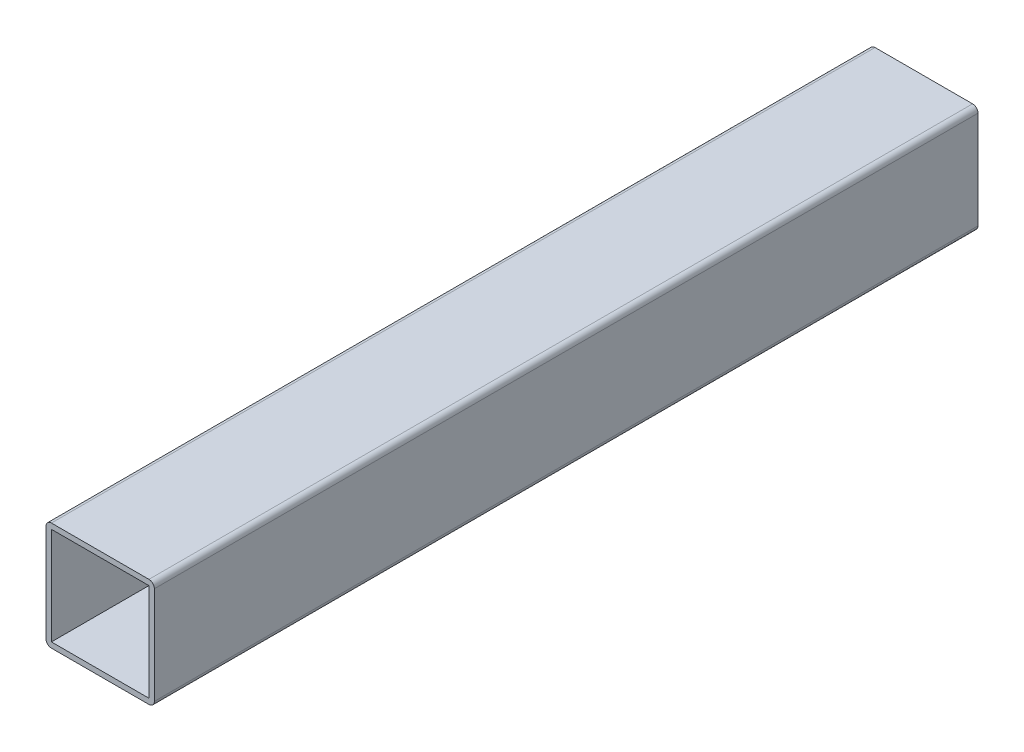
ISO-10303-21;
HEADER;
FILE_DESCRIPTION(('STEP AP214'),'2;1');
FILE_NAME('part.step','',(''),(''),'','','');
FILE_SCHEMA(('AUTOMOTIVE_DESIGN { 1 0 10303 214 1 1 1 1 }'));
ENDSEC;
DATA;
#1=APPLICATION_CONTEXT('core data for automotive mechanical design processes');
#2=APPLICATION_PROTOCOL_DEFINITION('international standard','automotive_design',2000,#1);
#3=PRODUCT_CONTEXT('',#1,'mechanical');
#4=PRODUCT('Part','Part','',(#3));
#5=PRODUCT_RELATED_PRODUCT_CATEGORY('part','',(#4));
#6=PRODUCT_DEFINITION_FORMATION('','',#4);
#7=PRODUCT_DEFINITION_CONTEXT('part definition',#1,'design');
#8=PRODUCT_DEFINITION('design','',#6,#7);
#9=PRODUCT_DEFINITION_SHAPE('','',#8);
#10=(LENGTH_UNIT() NAMED_UNIT(*) SI_UNIT(.MILLI.,.METRE.));
#11=(NAMED_UNIT(*) PLANE_ANGLE_UNIT() SI_UNIT($,.RADIAN.));
#12=(NAMED_UNIT(*) SI_UNIT($,.STERADIAN.) SOLID_ANGLE_UNIT());
#13=UNCERTAINTY_MEASURE_WITH_UNIT(LENGTH_MEASURE(1.E-05),#10,'distance_accuracy_value','');
#14=(GEOMETRIC_REPRESENTATION_CONTEXT(3) GLOBAL_UNCERTAINTY_ASSIGNED_CONTEXT((#13)) GLOBAL_UNIT_ASSIGNED_CONTEXT((#10,
#11,#12)) REPRESENTATION_CONTEXT('',''));
#15=CARTESIAN_POINT('',(0.,0.,0.));
#16=DIRECTION('',(0.,0.,1.));
#17=DIRECTION('',(1.,0.,0.));
#18=AXIS2_PLACEMENT_3D('',#15,#16,#17);
#19=CARTESIAN_POINT('',(-45.,45.,760.));
#20=DIRECTION('',(0.,0.,1.));
#21=DIRECTION('',(1.,0.,0.));
#22=AXIS2_PLACEMENT_3D('',#19,#20,#21);
#23=PLANE('',#22);
#24=CARTESIAN_POINT('',(-45.,45.,760.));
#25=DIRECTION('',(0.,0.,1.));
#26=DIRECTION('',(1.,0.,0.));
#27=AXIS2_PLACEMENT_3D('',#24,#25,#26);
#28=CIRCLE('',#27,4.99999999999999);
#29=CARTESIAN_POINT('',(-45.,50.,760.));
#30=VERTEX_POINT('',#29);
#31=CARTESIAN_POINT('',(-50.,45.,760.));
#32=VERTEX_POINT('',#31);
#33=EDGE_CURVE('E158',#30,#32,#28,.T.);
#34=ORIENTED_EDGE('',*,*,#33,.T.);
#35=DIRECTION('',(0.,-1.,0.));
#36=VECTOR('',#35,1.);
#37=CARTESIAN_POINT('',(-50.,-45.,760.));
#38=LINE('',#37,#36);
#39=CARTESIAN_POINT('',(-50.,-45.,760.));
#40=VERTEX_POINT('',#39);
#41=EDGE_CURVE('E161',#32,#40,#38,.T.);
#42=ORIENTED_EDGE('',*,*,#41,.T.);
#43=CARTESIAN_POINT('',(-45.,-45.,760.));
#44=DIRECTION('',(0.,0.,1.));
#45=DIRECTION('',(1.,0.,0.));
#46=AXIS2_PLACEMENT_3D('',#43,#44,#45);
#47=CIRCLE('',#46,5.);
#48=CARTESIAN_POINT('',(-45.,-50.,760.));
#49=VERTEX_POINT('',#48);
#50=EDGE_CURVE('E164',#40,#49,#47,.T.);
#51=ORIENTED_EDGE('',*,*,#50,.T.);
#52=DIRECTION('',(1.,0.,0.));
#53=VECTOR('',#52,1.);
#54=CARTESIAN_POINT('',(-45.,-50.,760.));
#55=LINE('',#54,#53);
#56=CARTESIAN_POINT('',(45.,-50.,760.));
#57=VERTEX_POINT('',#56);
#58=EDGE_CURVE('E166',#49,#57,#55,.T.);
#59=ORIENTED_EDGE('',*,*,#58,.T.);
#60=CARTESIAN_POINT('',(45.,-45.,760.));
#61=DIRECTION('',(0.,0.,1.));
#62=DIRECTION('',(1.,0.,0.));
#63=AXIS2_PLACEMENT_3D('',#60,#61,#62);
#64=CIRCLE('',#63,4.99999999999999);
#65=CARTESIAN_POINT('',(50.,-45.,760.));
#66=VERTEX_POINT('',#65);
#67=EDGE_CURVE('E168',#57,#66,#64,.T.);
#68=ORIENTED_EDGE('',*,*,#67,.T.);
#69=DIRECTION('',(0.,1.,0.));
#70=VECTOR('',#69,1.);
#71=CARTESIAN_POINT('',(50.,-45.,760.));
#72=LINE('',#71,#70);
#73=CARTESIAN_POINT('',(50.,45.,760.));
#74=VERTEX_POINT('',#73);
#75=EDGE_CURVE('E170',#66,#74,#72,.T.);
#76=ORIENTED_EDGE('',*,*,#75,.T.);
#77=CARTESIAN_POINT('',(45.,45.,760.));
#78=DIRECTION('',(0.,0.,1.));
#79=DIRECTION('',(1.,0.,0.));
#80=AXIS2_PLACEMENT_3D('',#77,#78,#79);
#81=CIRCLE('',#80,5.);
#82=CARTESIAN_POINT('',(45.,50.,760.));
#83=VERTEX_POINT('',#82);
#84=EDGE_CURVE('E172',#74,#83,#81,.T.);
#85=ORIENTED_EDGE('',*,*,#84,.T.);
#86=DIRECTION('',(-1.,0.,0.));
#87=VECTOR('',#86,1.);
#88=CARTESIAN_POINT('',(-45.,50.,760.));
#89=LINE('',#88,#87);
#90=EDGE_CURVE('E174',#83,#30,#89,.T.);
#91=ORIENTED_EDGE('',*,*,#90,.T.);
#92=EDGE_LOOP('',(#34,#42,#51,#59,#68,#76,#85,#91));
#93=FACE_BOUND('',#92,.T.);
#94=DIRECTION('',(1.,0.,0.));
#95=VECTOR('',#94,1.);
#96=CARTESIAN_POINT('',(-45.,-45.,760.));
#97=LINE('',#96,#95);
#98=CARTESIAN_POINT('',(-45.,-45.,760.));
#99=VERTEX_POINT('',#98);
#100=CARTESIAN_POINT('',(45.,-45.,760.));
#101=VERTEX_POINT('',#100);
#102=EDGE_CURVE('E130',#99,#101,#97,.T.);
#103=ORIENTED_EDGE('',*,*,#102,.F.);
#104=DIRECTION('',(0.,-1.,0.));
#105=VECTOR('',#104,1.);
#106=CARTESIAN_POINT('',(-45.,-45.,760.));
#107=LINE('',#106,#105);
#108=CARTESIAN_POINT('',(-45.,45.,760.));
#109=VERTEX_POINT('',#108);
#110=EDGE_CURVE('E122',#109,#99,#107,.T.);
#111=ORIENTED_EDGE('',*,*,#110,.F.);
#112=DIRECTION('',(-1.,0.,0.));
#113=VECTOR('',#112,1.);
#114=CARTESIAN_POINT('',(-45.,45.,760.));
#115=LINE('',#114,#113);
#116=CARTESIAN_POINT('',(45.,45.,760.));
#117=VERTEX_POINT('',#116);
#118=EDGE_CURVE('E144',#117,#109,#115,.T.);
#119=ORIENTED_EDGE('',*,*,#118,.F.);
#120=DIRECTION('',(0.,1.,0.));
#121=VECTOR('',#120,1.);
#122=CARTESIAN_POINT('',(45.,-45.,760.));
#123=LINE('',#122,#121);
#124=EDGE_CURVE('E142',#101,#117,#123,.T.);
#125=ORIENTED_EDGE('',*,*,#124,.F.);
#126=EDGE_LOOP('',(#103,#111,#119,#125));
#127=FACE_BOUND('',#126,.T.);
#128=ADVANCED_FACE('F33',(#93,#127),#23,.T.);
#129=CARTESIAN_POINT('',(-45.,45.,0.));
#130=DIRECTION('',(0.,0.,1.));
#131=DIRECTION('',(1.,0.,0.));
#132=AXIS2_PLACEMENT_3D('',#129,#130,#131);
#133=PLANE('',#132);
#134=CARTESIAN_POINT('',(-45.,45.,0.));
#135=DIRECTION('',(0.,0.,1.));
#136=DIRECTION('',(1.,0.,0.));
#137=AXIS2_PLACEMENT_3D('',#134,#135,#136);
#138=CIRCLE('',#137,4.99999999999999);
#139=CARTESIAN_POINT('',(-45.,50.,0.));
#140=VERTEX_POINT('',#139);
#141=CARTESIAN_POINT('',(-50.,45.,0.));
#142=VERTEX_POINT('',#141);
#143=EDGE_CURVE('E138',#140,#142,#138,.T.);
#144=ORIENTED_EDGE('',*,*,#143,.F.);
#145=DIRECTION('',(-1.,0.,0.));
#146=VECTOR('',#145,1.);
#147=CARTESIAN_POINT('',(-45.,50.,0.));
#148=LINE('',#147,#146);
#149=CARTESIAN_POINT('',(45.,50.,0.));
#150=VERTEX_POINT('',#149);
#151=EDGE_CURVE('E162',#150,#140,#148,.T.);
#152=ORIENTED_EDGE('',*,*,#151,.F.);
#153=CARTESIAN_POINT('',(45.,45.,0.));
#154=DIRECTION('',(0.,0.,1.));
#155=DIRECTION('',(1.,0.,0.));
#156=AXIS2_PLACEMENT_3D('',#153,#154,#155);
#157=CIRCLE('',#156,5.);
#158=CARTESIAN_POINT('',(50.,45.,0.));
#159=VERTEX_POINT('',#158);
#160=EDGE_CURVE('E189',#159,#150,#157,.T.);
#161=ORIENTED_EDGE('',*,*,#160,.F.);
#162=DIRECTION('',(0.,1.,0.));
#163=VECTOR('',#162,1.);
#164=CARTESIAN_POINT('',(50.,-45.,0.));
#165=LINE('',#164,#163);
#166=CARTESIAN_POINT('',(50.,-45.,0.));
#167=VERTEX_POINT('',#166);
#168=EDGE_CURVE('E187',#167,#159,#165,.T.);
#169=ORIENTED_EDGE('',*,*,#168,.F.);
#170=CARTESIAN_POINT('',(45.,-45.,0.));
#171=DIRECTION('',(0.,0.,1.));
#172=DIRECTION('',(1.,0.,0.));
#173=AXIS2_PLACEMENT_3D('',#170,#171,#172);
#174=CIRCLE('',#173,4.99999999999999);
#175=CARTESIAN_POINT('',(45.,-50.,0.));
#176=VERTEX_POINT('',#175);
#177=EDGE_CURVE('E185',#176,#167,#174,.T.);
#178=ORIENTED_EDGE('',*,*,#177,.F.);
#179=DIRECTION('',(1.,0.,0.));
#180=VECTOR('',#179,1.);
#181=CARTESIAN_POINT('',(-45.,-50.,0.));
#182=LINE('',#181,#180);
#183=CARTESIAN_POINT('',(-45.,-50.,0.));
#184=VERTEX_POINT('',#183);
#185=EDGE_CURVE('E183',#184,#176,#182,.T.);
#186=ORIENTED_EDGE('',*,*,#185,.F.);
#187=CARTESIAN_POINT('',(-45.,-45.,0.));
#188=DIRECTION('',(0.,0.,1.));
#189=DIRECTION('',(1.,0.,0.));
#190=AXIS2_PLACEMENT_3D('',#187,#188,#189);
#191=CIRCLE('',#190,5.);
#192=CARTESIAN_POINT('',(-50.,-45.,0.));
#193=VERTEX_POINT('',#192);
#194=EDGE_CURVE('E181',#193,#184,#191,.T.);
#195=ORIENTED_EDGE('',*,*,#194,.F.);
#196=DIRECTION('',(0.,-1.,0.));
#197=VECTOR('',#196,1.);
#198=CARTESIAN_POINT('',(-50.,-45.,0.));
#199=LINE('',#198,#197);
#200=EDGE_CURVE('E179',#142,#193,#199,.T.);
#201=ORIENTED_EDGE('',*,*,#200,.F.);
#202=EDGE_LOOP('',(#144,#152,#161,#169,#178,#186,#195,#201));
#203=FACE_BOUND('',#202,.T.);
#204=DIRECTION('',(0.,-1.,0.));
#205=VECTOR('',#204,1.);
#206=CARTESIAN_POINT('',(-45.,-45.,0.));
#207=LINE('',#206,#205);
#208=CARTESIAN_POINT('',(-45.,45.,0.));
#209=VERTEX_POINT('',#208);
#210=CARTESIAN_POINT('',(-45.,-45.,0.));
#211=VERTEX_POINT('',#210);
#212=EDGE_CURVE('E56',#209,#211,#207,.T.);
#213=ORIENTED_EDGE('',*,*,#212,.T.);
#214=DIRECTION('',(1.,0.,0.));
#215=VECTOR('',#214,1.);
#216=CARTESIAN_POINT('',(-45.,-45.,0.));
#217=LINE('',#216,#215);
#218=CARTESIAN_POINT('',(45.,-45.,0.));
#219=VERTEX_POINT('',#218);
#220=EDGE_CURVE('E137',#211,#219,#217,.T.);
#221=ORIENTED_EDGE('',*,*,#220,.T.);
#222=DIRECTION('',(0.,1.,0.));
#223=VECTOR('',#222,1.);
#224=CARTESIAN_POINT('',(45.,-45.,0.));
#225=LINE('',#224,#223);
#226=CARTESIAN_POINT('',(45.,45.,0.));
#227=VERTEX_POINT('',#226);
#228=EDGE_CURVE('E150',#219,#227,#225,.T.);
#229=ORIENTED_EDGE('',*,*,#228,.T.);
#230=DIRECTION('',(-1.,0.,0.));
#231=VECTOR('',#230,1.);
#232=CARTESIAN_POINT('',(-45.,45.,0.));
#233=LINE('',#232,#231);
#234=EDGE_CURVE('E131',#227,#209,#233,.T.);
#235=ORIENTED_EDGE('',*,*,#234,.T.);
#236=EDGE_LOOP('',(#213,#221,#229,#235));
#237=FACE_BOUND('',#236,.T.);
#238=ADVANCED_FACE('F219',(#203,#237),#133,.F.);
#239=CARTESIAN_POINT('',(-45.,45.,760.));
#240=DIRECTION('',(0.,0.,-1.));
#241=DIRECTION('',(-1.,0.,0.));
#242=AXIS2_PLACEMENT_3D('',#239,#240,#241);
#243=CYLINDRICAL_SURFACE('',#242,4.99999999999999);
#244=ORIENTED_EDGE('',*,*,#143,.T.);
#245=DIRECTION('',(0.,0.,-1.));
#246=VECTOR('',#245,1.);
#247=CARTESIAN_POINT('',(-50.,45.,760.));
#248=LINE('',#247,#246);
#249=EDGE_CURVE('E11',#32,#142,#248,.T.);
#250=ORIENTED_EDGE('',*,*,#249,.F.);
#251=ORIENTED_EDGE('',*,*,#33,.F.);
#252=DIRECTION('',(0.,0.,-1.));
#253=VECTOR('',#252,1.);
#254=CARTESIAN_POINT('',(-45.,50.,760.));
#255=LINE('',#254,#253);
#256=EDGE_CURVE('E176',#30,#140,#255,.T.);
#257=ORIENTED_EDGE('',*,*,#256,.T.);
#258=EDGE_LOOP('',(#244,#250,#251,#257));
#259=FACE_BOUND('',#258,.T.);
#260=ADVANCED_FACE('F35',(#259),#243,.T.);
#261=CARTESIAN_POINT('',(-50.,-45.,760.));
#262=DIRECTION('',(1.,0.,0.));
#263=DIRECTION('',(0.,1.,0.));
#264=AXIS2_PLACEMENT_3D('',#261,#262,#263);
#265=PLANE('',#264);
#266=ORIENTED_EDGE('',*,*,#200,.T.);
#267=DIRECTION('',(0.,0.,-1.));
#268=VECTOR('',#267,1.);
#269=CARTESIAN_POINT('',(-50.,-45.,760.));
#270=LINE('',#269,#268);
#271=EDGE_CURVE('E41',#40,#193,#270,.T.);
#272=ORIENTED_EDGE('',*,*,#271,.F.);
#273=ORIENTED_EDGE('',*,*,#41,.F.);
#274=ORIENTED_EDGE('',*,*,#249,.T.);
#275=EDGE_LOOP('',(#266,#272,#273,#274));
#276=FACE_BOUND('',#275,.T.);
#277=ADVANCED_FACE('F236',(#276),#265,.F.);
#278=CARTESIAN_POINT('',(-45.,-45.,760.));
#279=DIRECTION('',(0.,0.,-1.));
#280=DIRECTION('',(-1.,0.,0.));
#281=AXIS2_PLACEMENT_3D('',#278,#279,#280);
#282=CYLINDRICAL_SURFACE('',#281,5.);
#283=ORIENTED_EDGE('',*,*,#194,.T.);
#284=DIRECTION('',(0.,0.,-1.));
#285=VECTOR('',#284,1.);
#286=CARTESIAN_POINT('',(-45.,-50.,760.));
#287=LINE('',#286,#285);
#288=EDGE_CURVE('E206',#49,#184,#287,.T.);
#289=ORIENTED_EDGE('',*,*,#288,.F.);
#290=ORIENTED_EDGE('',*,*,#50,.F.);
#291=ORIENTED_EDGE('',*,*,#271,.T.);
#292=EDGE_LOOP('',(#283,#289,#290,#291));
#293=FACE_BOUND('',#292,.T.);
#294=ADVANCED_FACE('F213',(#293),#282,.T.);
#295=CARTESIAN_POINT('',(-45.,-50.,760.));
#296=DIRECTION('',(0.,1.,0.));
#297=DIRECTION('',(-1.,0.,0.));
#298=AXIS2_PLACEMENT_3D('',#295,#296,#297);
#299=PLANE('',#298);
#300=ORIENTED_EDGE('',*,*,#185,.T.);
#301=DIRECTION('',(0.,0.,-1.));
#302=VECTOR('',#301,1.);
#303=CARTESIAN_POINT('',(45.,-50.,760.));
#304=LINE('',#303,#302);
#305=EDGE_CURVE('E203',#57,#176,#304,.T.);
#306=ORIENTED_EDGE('',*,*,#305,.F.);
#307=ORIENTED_EDGE('',*,*,#58,.F.);
#308=ORIENTED_EDGE('',*,*,#288,.T.);
#309=EDGE_LOOP('',(#300,#306,#307,#308));
#310=FACE_BOUND('',#309,.T.);
#311=ADVANCED_FACE('F225',(#310),#299,.F.);
#312=CARTESIAN_POINT('',(45.,-45.,760.));
#313=DIRECTION('',(0.,0.,-1.));
#314=DIRECTION('',(-1.,0.,0.));
#315=AXIS2_PLACEMENT_3D('',#312,#313,#314);
#316=CYLINDRICAL_SURFACE('',#315,4.99999999999999);
#317=ORIENTED_EDGE('',*,*,#177,.T.);
#318=DIRECTION('',(0.,0.,-1.));
#319=VECTOR('',#318,1.);
#320=CARTESIAN_POINT('',(50.,-45.,760.));
#321=LINE('',#320,#319);
#322=EDGE_CURVE('E200',#66,#167,#321,.T.);
#323=ORIENTED_EDGE('',*,*,#322,.F.);
#324=ORIENTED_EDGE('',*,*,#67,.F.);
#325=ORIENTED_EDGE('',*,*,#305,.T.);
#326=EDGE_LOOP('',(#317,#323,#324,#325));
#327=FACE_BOUND('',#326,.T.);
#328=ADVANCED_FACE('F229',(#327),#316,.T.);
#329=CARTESIAN_POINT('',(50.,-45.,760.));
#330=DIRECTION('',(-1.,0.,0.));
#331=DIRECTION('',(0.,-1.,0.));
#332=AXIS2_PLACEMENT_3D('',#329,#330,#331);
#333=PLANE('',#332);
#334=ORIENTED_EDGE('',*,*,#168,.T.);
#335=DIRECTION('',(0.,0.,-1.));
#336=VECTOR('',#335,1.);
#337=CARTESIAN_POINT('',(50.,45.,760.));
#338=LINE('',#337,#336);
#339=EDGE_CURVE('E197',#74,#159,#338,.T.);
#340=ORIENTED_EDGE('',*,*,#339,.F.);
#341=ORIENTED_EDGE('',*,*,#75,.F.);
#342=ORIENTED_EDGE('',*,*,#322,.T.);
#343=EDGE_LOOP('',(#334,#340,#341,#342));
#344=FACE_BOUND('',#343,.T.);
#345=ADVANCED_FACE('F249',(#344),#333,.F.);
#346=CARTESIAN_POINT('',(45.,45.,760.));
#347=DIRECTION('',(0.,0.,-1.));
#348=DIRECTION('',(-1.,0.,0.));
#349=AXIS2_PLACEMENT_3D('',#346,#347,#348);
#350=CYLINDRICAL_SURFACE('',#349,5.);
#351=ORIENTED_EDGE('',*,*,#160,.T.);
#352=DIRECTION('',(0.,0.,-1.));
#353=VECTOR('',#352,1.);
#354=CARTESIAN_POINT('',(45.,50.,760.));
#355=LINE('',#354,#353);
#356=EDGE_CURVE('E194',#83,#150,#355,.T.);
#357=ORIENTED_EDGE('',*,*,#356,.F.);
#358=ORIENTED_EDGE('',*,*,#84,.F.);
#359=ORIENTED_EDGE('',*,*,#339,.T.);
#360=EDGE_LOOP('',(#351,#357,#358,#359));
#361=FACE_BOUND('',#360,.T.);
#362=ADVANCED_FACE('F247',(#361),#350,.T.);
#363=CARTESIAN_POINT('',(-45.,50.,760.));
#364=DIRECTION('',(0.,-1.,0.));
#365=DIRECTION('',(0.,0.,-1.));
#366=AXIS2_PLACEMENT_3D('',#363,#364,#365);
#367=PLANE('',#366);
#368=ORIENTED_EDGE('',*,*,#151,.T.);
#369=ORIENTED_EDGE('',*,*,#256,.F.);
#370=ORIENTED_EDGE('',*,*,#90,.F.);
#371=ORIENTED_EDGE('',*,*,#356,.T.);
#372=EDGE_LOOP('',(#368,#369,#370,#371));
#373=FACE_BOUND('',#372,.T.);
#374=ADVANCED_FACE('F242',(#373),#367,.F.);
#375=CARTESIAN_POINT('',(-45.,-45.,760.));
#376=DIRECTION('',(1.,0.,0.));
#377=DIRECTION('',(0.,0.,-1.));
#378=AXIS2_PLACEMENT_3D('',#375,#376,#377);
#379=PLANE('',#378);
#380=ORIENTED_EDGE('',*,*,#212,.F.);
#381=DIRECTION('',(0.,0.,-1.));
#382=VECTOR('',#381,1.);
#383=CARTESIAN_POINT('',(-45.,45.,760.));
#384=LINE('',#383,#382);
#385=EDGE_CURVE('E126',#109,#209,#384,.T.);
#386=ORIENTED_EDGE('',*,*,#385,.F.);
#387=ORIENTED_EDGE('',*,*,#110,.T.);
#388=DIRECTION('',(0.,0.,-1.));
#389=VECTOR('',#388,1.);
#390=CARTESIAN_POINT('',(-45.,-45.,760.));
#391=LINE('',#390,#389);
#392=EDGE_CURVE('E125',#99,#211,#391,.T.);
#393=ORIENTED_EDGE('',*,*,#392,.T.);
#394=EDGE_LOOP('',(#380,#386,#387,#393));
#395=FACE_BOUND('',#394,.T.);
#396=ADVANCED_FACE('F124',(#395),#379,.T.);
#397=CARTESIAN_POINT('',(-45.,-45.,760.));
#398=DIRECTION('',(0.,1.,0.));
#399=DIRECTION('',(0.,0.,1.));
#400=AXIS2_PLACEMENT_3D('',#397,#398,#399);
#401=PLANE('',#400);
#402=ORIENTED_EDGE('',*,*,#220,.F.);
#403=ORIENTED_EDGE('',*,*,#392,.F.);
#404=ORIENTED_EDGE('',*,*,#102,.T.);
#405=DIRECTION('',(0.,0.,-1.));
#406=VECTOR('',#405,1.);
#407=CARTESIAN_POINT('',(45.,-45.,760.));
#408=LINE('',#407,#406);
#409=EDGE_CURVE('E139',#101,#219,#408,.T.);
#410=ORIENTED_EDGE('',*,*,#409,.T.);
#411=EDGE_LOOP('',(#402,#403,#404,#410));
#412=FACE_BOUND('',#411,.T.);
#413=ADVANCED_FACE('F134',(#412),#401,.T.);
#414=CARTESIAN_POINT('',(45.,-45.,760.));
#415=DIRECTION('',(-1.,0.,0.));
#416=DIRECTION('',(0.,0.,1.));
#417=AXIS2_PLACEMENT_3D('',#414,#415,#416);
#418=PLANE('',#417);
#419=ORIENTED_EDGE('',*,*,#228,.F.);
#420=ORIENTED_EDGE('',*,*,#409,.F.);
#421=ORIENTED_EDGE('',*,*,#124,.T.);
#422=DIRECTION('',(0.,0.,-1.));
#423=VECTOR('',#422,1.);
#424=CARTESIAN_POINT('',(45.,45.,760.));
#425=LINE('',#424,#423);
#426=EDGE_CURVE('E48',#117,#227,#425,.T.);
#427=ORIENTED_EDGE('',*,*,#426,.T.);
#428=EDGE_LOOP('',(#419,#420,#421,#427));
#429=FACE_BOUND('',#428,.T.);
#430=ADVANCED_FACE('F274',(#429),#418,.T.);
#431=CARTESIAN_POINT('',(-45.,45.,760.));
#432=DIRECTION('',(0.,-1.,0.));
#433=DIRECTION('',(0.,0.,-1.));
#434=AXIS2_PLACEMENT_3D('',#431,#432,#433);
#435=PLANE('',#434);
#436=ORIENTED_EDGE('',*,*,#234,.F.);
#437=ORIENTED_EDGE('',*,*,#426,.F.);
#438=ORIENTED_EDGE('',*,*,#118,.T.);
#439=ORIENTED_EDGE('',*,*,#385,.T.);
#440=EDGE_LOOP('',(#436,#437,#438,#439));
#441=FACE_BOUND('',#440,.T.);
#442=ADVANCED_FACE('F278',(#441),#435,.T.);
#443=CLOSED_SHELL('',(#128,#238,#260,#277,#294,#311,#328,#345,#362,#374,#396,#413,#430,#442));
#444=MANIFOLD_SOLID_BREP('B2',#443);
#445=ADVANCED_BREP_SHAPE_REPRESENTATION('',(#18,#444),#14);
#446=SHAPE_DEFINITION_REPRESENTATION(#9,#445);
ENDSEC;
END-ISO-10303-21;
